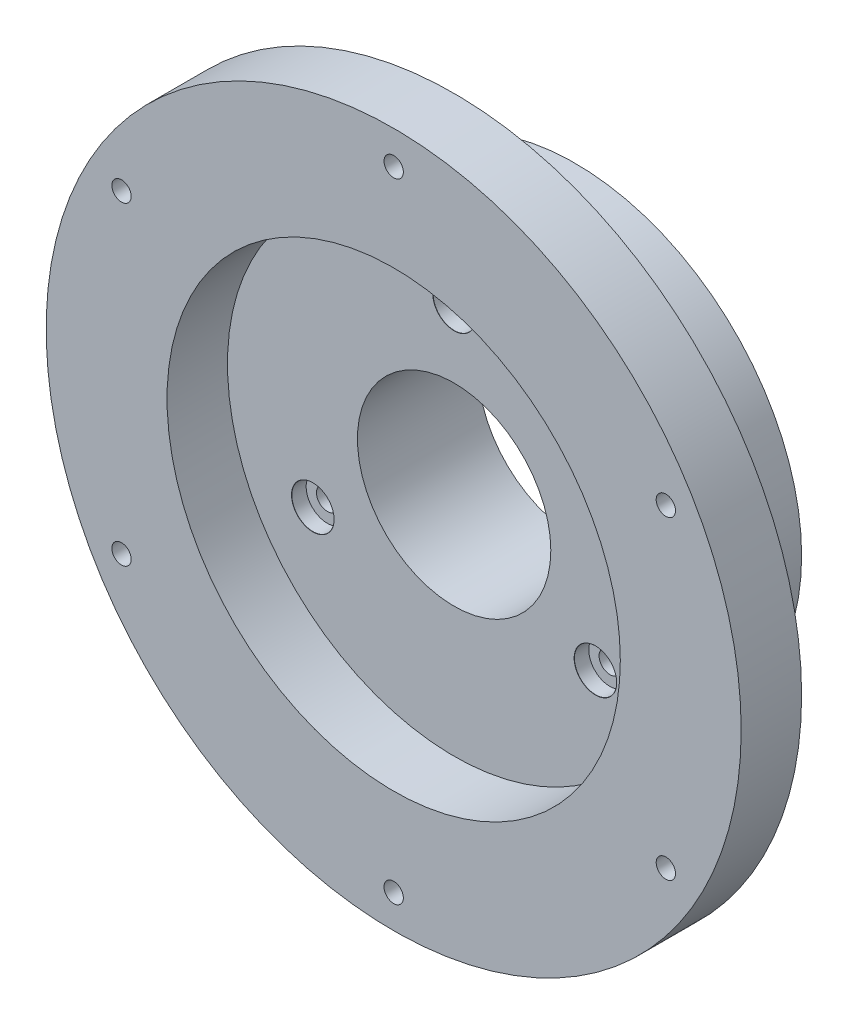
ISO-10303-21;
HEADER;
FILE_DESCRIPTION(('STEP AP214'),'2;1');
FILE_NAME('part.step','',(''),(''),'','','');
FILE_SCHEMA(('AUTOMOTIVE_DESIGN { 1 0 10303 214 1 1 1 1 }'));
ENDSEC;
DATA;
#1=APPLICATION_CONTEXT('core data for automotive mechanical design processes');
#2=APPLICATION_PROTOCOL_DEFINITION('international standard','automotive_design',2000,#1);
#3=PRODUCT_CONTEXT('',#1,'mechanical');
#4=PRODUCT('Part','Part','',(#3));
#5=PRODUCT_RELATED_PRODUCT_CATEGORY('part','',(#4));
#6=PRODUCT_DEFINITION_FORMATION('','',#4);
#7=PRODUCT_DEFINITION_CONTEXT('part definition',#1,'design');
#8=PRODUCT_DEFINITION('design','',#6,#7);
#9=PRODUCT_DEFINITION_SHAPE('','',#8);
#10=(LENGTH_UNIT() NAMED_UNIT(*) SI_UNIT(.MILLI.,.METRE.));
#11=(NAMED_UNIT(*) PLANE_ANGLE_UNIT() SI_UNIT($,.RADIAN.));
#12=(NAMED_UNIT(*) SI_UNIT($,.STERADIAN.) SOLID_ANGLE_UNIT());
#13=UNCERTAINTY_MEASURE_WITH_UNIT(LENGTH_MEASURE(1.E-05),#10,'distance_accuracy_value','');
#14=(GEOMETRIC_REPRESENTATION_CONTEXT(3) GLOBAL_UNCERTAINTY_ASSIGNED_CONTEXT((#13)) GLOBAL_UNIT_ASSIGNED_CONTEXT((#10,
#11,#12)) REPRESENTATION_CONTEXT('',''));
#15=CARTESIAN_POINT('',(0.,0.,0.));
#16=DIRECTION('',(0.,0.,1.));
#17=DIRECTION('',(1.,0.,0.));
#18=AXIS2_PLACEMENT_3D('',#15,#16,#17);
#19=CARTESIAN_POINT('',(0.,0.,-142.634559672906));
#20=DIRECTION('',(0.,0.,1.));
#21=DIRECTION('',(1.,0.,0.));
#22=AXIS2_PLACEMENT_3D('',#19,#20,#21);
#23=CYLINDRICAL_SURFACE('',#22,57.5);
#24=CARTESIAN_POINT('',(0.,0.,20.));
#25=DIRECTION('',(0.,0.,1.));
#26=DIRECTION('',(1.,0.,0.));
#27=AXIS2_PLACEMENT_3D('',#24,#25,#26);
#28=CIRCLE('',#27,57.5);
#29=CARTESIAN_POINT('',(57.5,0.,20.));
#30=VERTEX_POINT('',#29);
#31=EDGE_CURVE('E11',#30,#30,#28,.F.);
#32=ORIENTED_EDGE('',*,*,#31,.F.);
#33=EDGE_LOOP('',(#32));
#34=FACE_BOUND('',#33,.T.);
#35=CARTESIAN_POINT('',(0.,0.,30.));
#36=DIRECTION('',(0.,0.,1.));
#37=DIRECTION('',(1.,0.,0.));
#38=AXIS2_PLACEMENT_3D('',#35,#36,#37);
#39=CIRCLE('',#38,57.5);
#40=CARTESIAN_POINT('',(57.5,0.,30.));
#41=VERTEX_POINT('',#40);
#42=EDGE_CURVE('E57',#41,#41,#39,.T.);
#43=ORIENTED_EDGE('',*,*,#42,.F.);
#44=EDGE_LOOP('',(#43));
#45=FACE_BOUND('',#44,.T.);
#46=ADVANCED_FACE('F45',(#34,#45),#23,.T.);
#47=CARTESIAN_POINT('',(0.,0.,30.));
#48=DIRECTION('',(0.,0.,1.));
#49=DIRECTION('',(1.,0.,0.));
#50=AXIS2_PLACEMENT_3D('',#47,#48,#49);
#51=PLANE('',#50);
#52=CARTESIAN_POINT('',(0.,52.,30.));
#53=DIRECTION('',(0.,0.,1.));
#54=DIRECTION('',(1.,0.,0.));
#55=AXIS2_PLACEMENT_3D('',#52,#53,#54);
#56=CIRCLE('',#55,1.6);
#57=CARTESIAN_POINT('',(1.6,52.,30.));
#58=VERTEX_POINT('',#57);
#59=EDGE_CURVE('E72',#58,#58,#56,.T.);
#60=ORIENTED_EDGE('',*,*,#59,.F.);
#61=EDGE_LOOP('',(#60));
#62=FACE_BOUND('',#61,.T.);
#63=CARTESIAN_POINT('',(-45.0333209967897,25.9999999999981,30.));
#64=DIRECTION('',(0.,0.,1.));
#65=DIRECTION('',(1.,0.,0.));
#66=AXIS2_PLACEMENT_3D('',#63,#64,#65);
#67=CIRCLE('',#66,1.60000000000223);
#68=CARTESIAN_POINT('',(-43.4333209967875,25.9999999999981,30.));
#69=VERTEX_POINT('',#68);
#70=EDGE_CURVE('E157',#69,#69,#67,.T.);
#71=ORIENTED_EDGE('',*,*,#70,.F.);
#72=EDGE_LOOP('',(#71));
#73=FACE_BOUND('',#72,.T.);
#74=CARTESIAN_POINT('',(-45.0333209967875,-26.0000000000019,30.));
#75=DIRECTION('',(0.,0.,1.));
#76=DIRECTION('',(1.,0.,0.));
#77=AXIS2_PLACEMENT_3D('',#74,#75,#76);
#78=CIRCLE('',#77,1.60000000000421);
#79=CARTESIAN_POINT('',(-43.4333209967833,-26.0000000000019,30.));
#80=VERTEX_POINT('',#79);
#81=EDGE_CURVE('E61',#80,#80,#78,.T.);
#82=ORIENTED_EDGE('',*,*,#81,.F.);
#83=EDGE_LOOP('',(#82));
#84=FACE_BOUND('',#83,.T.);
#85=CARTESIAN_POINT('',(4.41468218107633E-12,-52.,30.));
#86=DIRECTION('',(0.,0.,1.));
#87=DIRECTION('',(1.,0.,0.));
#88=AXIS2_PLACEMENT_3D('',#85,#86,#87);
#89=CIRCLE('',#88,1.60000000000457);
#90=CARTESIAN_POINT('',(1.60000000000898,-52.,30.));
#91=VERTEX_POINT('',#90);
#92=EDGE_CURVE('E154',#91,#91,#89,.T.);
#93=ORIENTED_EDGE('',*,*,#92,.F.);
#94=EDGE_LOOP('',(#93));
#95=FACE_BOUND('',#94,.T.);
#96=CARTESIAN_POINT('',(45.0333209967941,-25.9999999999981,30.));
#97=DIRECTION('',(0.,0.,1.));
#98=DIRECTION('',(1.,0.,0.));
#99=AXIS2_PLACEMENT_3D('',#96,#97,#98);
#100=CIRCLE('',#99,1.60000000000285);
#101=CARTESIAN_POINT('',(46.633320996797,-25.9999999999981,30.));
#102=VERTEX_POINT('',#101);
#103=EDGE_CURVE('E150',#102,#102,#100,.T.);
#104=ORIENTED_EDGE('',*,*,#103,.F.);
#105=EDGE_LOOP('',(#104));
#106=FACE_BOUND('',#105,.T.);
#107=CARTESIAN_POINT('',(45.0333209967919,26.0000000000019,30.));
#108=DIRECTION('',(0.,0.,1.));
#109=DIRECTION('',(1.,0.,0.));
#110=AXIS2_PLACEMENT_3D('',#107,#108,#109);
#111=CIRCLE('',#110,1.60000000000062);
#112=CARTESIAN_POINT('',(46.6333209967925,26.0000000000019,30.));
#113=VERTEX_POINT('',#112);
#114=EDGE_CURVE('E141',#113,#113,#111,.T.);
#115=ORIENTED_EDGE('',*,*,#114,.F.);
#116=EDGE_LOOP('',(#115));
#117=FACE_BOUND('',#116,.T.);
#118=CARTESIAN_POINT('',(0.,0.,30.));
#119=DIRECTION('',(0.,0.,1.));
#120=DIRECTION('',(1.,0.,0.));
#121=AXIS2_PLACEMENT_3D('',#118,#119,#120);
#122=CIRCLE('',#121,37.5);
#123=CARTESIAN_POINT('',(37.5,0.,30.));
#124=VERTEX_POINT('',#123);
#125=EDGE_CURVE('E63',#124,#124,#122,.T.);
#126=ORIENTED_EDGE('',*,*,#125,.F.);
#127=EDGE_LOOP('',(#126));
#128=FACE_BOUND('',#127,.T.);
#129=ORIENTED_EDGE('',*,*,#42,.T.);
#130=EDGE_LOOP('',(#129));
#131=FACE_BOUND('',#130,.T.);
#132=ADVANCED_FACE('F102',(#62,#73,#84,#95,#106,#117,#128,#131),#51,.T.);
#133=CARTESIAN_POINT('',(0.,0.,-142.634559672906));
#134=DIRECTION('',(0.,0.,1.));
#135=DIRECTION('',(1.,0.,0.));
#136=AXIS2_PLACEMENT_3D('',#133,#134,#135);
#137=CYLINDRICAL_SURFACE('',#136,37.5);
#138=CARTESIAN_POINT('',(0.,0.,20.));
#139=DIRECTION('',(0.,0.,1.));
#140=DIRECTION('',(1.,0.,0.));
#141=AXIS2_PLACEMENT_3D('',#138,#139,#140);
#142=CIRCLE('',#141,37.5);
#143=CARTESIAN_POINT('',(37.5,0.,20.));
#144=VERTEX_POINT('',#143);
#145=EDGE_CURVE('E52',#144,#144,#142,.F.);
#146=ORIENTED_EDGE('',*,*,#145,.T.);
#147=EDGE_LOOP('',(#146));
#148=FACE_BOUND('',#147,.T.);
#149=ORIENTED_EDGE('',*,*,#125,.T.);
#150=EDGE_LOOP('',(#149));
#151=FACE_BOUND('',#150,.T.);
#152=ADVANCED_FACE('F107',(#148,#151),#137,.F.);
#153=CARTESIAN_POINT('',(0.,0.,20.));
#154=DIRECTION('',(0.,0.,1.));
#155=DIRECTION('',(1.,0.,0.));
#156=AXIS2_PLACEMENT_3D('',#153,#154,#155);
#157=PLANE('',#156);
#158=CARTESIAN_POINT('',(0.,52.,20.));
#159=DIRECTION('',(0.,0.,1.));
#160=DIRECTION('',(1.,0.,0.));
#161=AXIS2_PLACEMENT_3D('',#158,#159,#160);
#162=CIRCLE('',#161,1.6);
#163=CARTESIAN_POINT('',(1.6,52.,20.));
#164=VERTEX_POINT('',#163);
#165=EDGE_CURVE('E48',#164,#164,#162,.T.);
#166=ORIENTED_EDGE('',*,*,#165,.T.);
#167=EDGE_LOOP('',(#166));
#168=FACE_BOUND('',#167,.T.);
#169=CARTESIAN_POINT('',(-45.0333209967897,25.9999999999981,20.));
#170=DIRECTION('',(0.,0.,1.));
#171=DIRECTION('',(1.,0.,0.));
#172=AXIS2_PLACEMENT_3D('',#169,#170,#171);
#173=CIRCLE('',#172,1.60000000000223);
#174=CARTESIAN_POINT('',(-43.4333209967875,25.9999999999981,20.));
#175=VERTEX_POINT('',#174);
#176=EDGE_CURVE('E80',#175,#175,#173,.T.);
#177=ORIENTED_EDGE('',*,*,#176,.T.);
#178=EDGE_LOOP('',(#177));
#179=FACE_BOUND('',#178,.T.);
#180=CARTESIAN_POINT('',(-45.0333209967875,-26.0000000000019,20.));
#181=DIRECTION('',(0.,0.,1.));
#182=DIRECTION('',(1.,0.,0.));
#183=AXIS2_PLACEMENT_3D('',#180,#181,#182);
#184=CIRCLE('',#183,1.60000000000421);
#185=CARTESIAN_POINT('',(-43.4333209967833,-26.0000000000019,20.));
#186=VERTEX_POINT('',#185);
#187=EDGE_CURVE('E78',#186,#186,#184,.T.);
#188=ORIENTED_EDGE('',*,*,#187,.T.);
#189=EDGE_LOOP('',(#188));
#190=FACE_BOUND('',#189,.T.);
#191=CARTESIAN_POINT('',(4.41468218107633E-12,-52.,20.));
#192=DIRECTION('',(0.,0.,1.));
#193=DIRECTION('',(1.,0.,0.));
#194=AXIS2_PLACEMENT_3D('',#191,#192,#193);
#195=CIRCLE('',#194,1.60000000000457);
#196=CARTESIAN_POINT('',(1.60000000000898,-52.,20.));
#197=VERTEX_POINT('',#196);
#198=EDGE_CURVE('E75',#197,#197,#195,.T.);
#199=ORIENTED_EDGE('',*,*,#198,.T.);
#200=EDGE_LOOP('',(#199));
#201=FACE_BOUND('',#200,.T.);
#202=CARTESIAN_POINT('',(45.0333209967941,-25.9999999999981,20.));
#203=DIRECTION('',(0.,0.,1.));
#204=DIRECTION('',(1.,0.,0.));
#205=AXIS2_PLACEMENT_3D('',#202,#203,#204);
#206=CIRCLE('',#205,1.60000000000285);
#207=CARTESIAN_POINT('',(46.633320996797,-25.9999999999981,20.));
#208=VERTEX_POINT('',#207);
#209=EDGE_CURVE('E71',#208,#208,#206,.T.);
#210=ORIENTED_EDGE('',*,*,#209,.T.);
#211=EDGE_LOOP('',(#210));
#212=FACE_BOUND('',#211,.T.);
#213=CARTESIAN_POINT('',(45.0333209967919,26.0000000000019,20.));
#214=DIRECTION('',(0.,0.,1.));
#215=DIRECTION('',(1.,0.,0.));
#216=AXIS2_PLACEMENT_3D('',#213,#214,#215);
#217=CIRCLE('',#216,1.60000000000062);
#218=CARTESIAN_POINT('',(46.6333209967925,26.0000000000019,20.));
#219=VERTEX_POINT('',#218);
#220=EDGE_CURVE('E68',#219,#219,#217,.T.);
#221=ORIENTED_EDGE('',*,*,#220,.T.);
#222=EDGE_LOOP('',(#221));
#223=FACE_BOUND('',#222,.T.);
#224=ORIENTED_EDGE('',*,*,#31,.T.);
#225=EDGE_LOOP('',(#224));
#226=FACE_BOUND('',#225,.T.);
#227=ORIENTED_EDGE('',*,*,#145,.F.);
#228=EDGE_LOOP('',(#227));
#229=FACE_BOUND('',#228,.T.);
#230=ADVANCED_FACE('F87',(#168,#179,#190,#201,#212,#223,#226,#229),#157,.F.);
#231=CARTESIAN_POINT('',(45.0333209967919,26.0000000000019,0.));
#232=DIRECTION('',(0.,0.,1.));
#233=DIRECTION('',(1.,0.,0.));
#234=AXIS2_PLACEMENT_3D('',#231,#232,#233);
#235=CYLINDRICAL_SURFACE('',#234,1.60000000000062);
#236=ORIENTED_EDGE('',*,*,#114,.T.);
#237=EDGE_LOOP('',(#236));
#238=FACE_BOUND('',#237,.T.);
#239=ORIENTED_EDGE('',*,*,#220,.F.);
#240=EDGE_LOOP('',(#239));
#241=FACE_BOUND('',#240,.T.);
#242=ADVANCED_FACE('F122',(#238,#241),#235,.F.);
#243=CARTESIAN_POINT('',(45.0333209967941,-25.9999999999981,0.));
#244=DIRECTION('',(0.,0.,1.));
#245=DIRECTION('',(1.,0.,0.));
#246=AXIS2_PLACEMENT_3D('',#243,#244,#245);
#247=CYLINDRICAL_SURFACE('',#246,1.60000000000285);
#248=ORIENTED_EDGE('',*,*,#103,.T.);
#249=EDGE_LOOP('',(#248));
#250=FACE_BOUND('',#249,.T.);
#251=ORIENTED_EDGE('',*,*,#209,.F.);
#252=EDGE_LOOP('',(#251));
#253=FACE_BOUND('',#252,.T.);
#254=ADVANCED_FACE('F129',(#250,#253),#247,.F.);
#255=CARTESIAN_POINT('',(4.41468218107633E-12,-52.,0.));
#256=DIRECTION('',(0.,0.,1.));
#257=DIRECTION('',(1.,0.,0.));
#258=AXIS2_PLACEMENT_3D('',#255,#256,#257);
#259=CYLINDRICAL_SURFACE('',#258,1.60000000000457);
#260=ORIENTED_EDGE('',*,*,#92,.T.);
#261=EDGE_LOOP('',(#260));
#262=FACE_BOUND('',#261,.T.);
#263=ORIENTED_EDGE('',*,*,#198,.F.);
#264=EDGE_LOOP('',(#263));
#265=FACE_BOUND('',#264,.T.);
#266=ADVANCED_FACE('F125',(#262,#265),#259,.F.);
#267=CARTESIAN_POINT('',(-45.0333209967875,-26.0000000000019,0.));
#268=DIRECTION('',(0.,0.,1.));
#269=DIRECTION('',(1.,0.,0.));
#270=AXIS2_PLACEMENT_3D('',#267,#268,#269);
#271=CYLINDRICAL_SURFACE('',#270,1.60000000000421);
#272=ORIENTED_EDGE('',*,*,#81,.T.);
#273=EDGE_LOOP('',(#272));
#274=FACE_BOUND('',#273,.T.);
#275=ORIENTED_EDGE('',*,*,#187,.F.);
#276=EDGE_LOOP('',(#275));
#277=FACE_BOUND('',#276,.T.);
#278=ADVANCED_FACE('F97',(#274,#277),#271,.F.);
#279=CARTESIAN_POINT('',(-45.0333209967897,25.9999999999981,0.));
#280=DIRECTION('',(0.,0.,1.));
#281=DIRECTION('',(1.,0.,0.));
#282=AXIS2_PLACEMENT_3D('',#279,#280,#281);
#283=CYLINDRICAL_SURFACE('',#282,1.60000000000223);
#284=ORIENTED_EDGE('',*,*,#70,.T.);
#285=EDGE_LOOP('',(#284));
#286=FACE_BOUND('',#285,.T.);
#287=ORIENTED_EDGE('',*,*,#176,.F.);
#288=EDGE_LOOP('',(#287));
#289=FACE_BOUND('',#288,.T.);
#290=ADVANCED_FACE('F91',(#286,#289),#283,.F.);
#291=CARTESIAN_POINT('',(0.,52.,0.));
#292=DIRECTION('',(0.,0.,1.));
#293=DIRECTION('',(1.,0.,0.));
#294=AXIS2_PLACEMENT_3D('',#291,#292,#293);
#295=CYLINDRICAL_SURFACE('',#294,1.6);
#296=ORIENTED_EDGE('',*,*,#59,.T.);
#297=EDGE_LOOP('',(#296));
#298=FACE_BOUND('',#297,.T.);
#299=ORIENTED_EDGE('',*,*,#165,.F.);
#300=EDGE_LOOP('',(#299));
#301=FACE_BOUND('',#300,.T.);
#302=ADVANCED_FACE('F89',(#298,#301),#295,.F.);
#303=CLOSED_SHELL('',(#46,#132,#152,#230,#242,#254,#266,#278,#290,#302));
#304=MANIFOLD_SOLID_BREP('B2',#303);
#305=CARTESIAN_POINT('',(0.,0.,20.));
#306=DIRECTION('',(0.,0.,1.));
#307=DIRECTION('',(1.,0.,0.));
#308=AXIS2_PLACEMENT_3D('',#305,#306,#307);
#309=PLANE('',#308);
#310=CARTESIAN_POINT('',(0.,27.,20.));
#311=DIRECTION('',(0.,0.,1.));
#312=DIRECTION('',(1.,0.,0.));
#313=AXIS2_PLACEMENT_3D('',#310,#311,#312);
#314=CIRCLE('',#313,3.525);
#315=CARTESIAN_POINT('',(3.525,27.,20.));
#316=VERTEX_POINT('',#315);
#317=EDGE_CURVE('E311',#316,#316,#314,.T.);
#318=ORIENTED_EDGE('',*,*,#317,.F.);
#319=EDGE_LOOP('',(#318));
#320=FACE_BOUND('',#319,.T.);
#321=CARTESIAN_POINT('',(-23.3826859021799,-13.4999999999999,20.));
#322=DIRECTION('',(0.,0.,1.));
#323=DIRECTION('',(1.,0.,0.));
#324=AXIS2_PLACEMENT_3D('',#321,#322,#323);
#325=CIRCLE('',#324,3.525);
#326=CARTESIAN_POINT('',(-19.8576859021799,-13.4999999999999,20.));
#327=VERTEX_POINT('',#326);
#328=EDGE_CURVE('E291',#327,#327,#325,.T.);
#329=ORIENTED_EDGE('',*,*,#328,.F.);
#330=EDGE_LOOP('',(#329));
#331=FACE_BOUND('',#330,.T.);
#332=CARTESIAN_POINT('',(23.3826859021799,-13.4999999999999,20.));
#333=DIRECTION('',(0.,0.,1.));
#334=DIRECTION('',(1.,0.,0.));
#335=AXIS2_PLACEMENT_3D('',#332,#333,#334);
#336=CIRCLE('',#335,3.525);
#337=CARTESIAN_POINT('',(26.9076859021799,-13.4999999999999,20.));
#338=VERTEX_POINT('',#337);
#339=EDGE_CURVE('E271',#338,#338,#336,.T.);
#340=ORIENTED_EDGE('',*,*,#339,.F.);
#341=EDGE_LOOP('',(#340));
#342=FACE_BOUND('',#341,.T.);
#343=CARTESIAN_POINT('',(0.,0.,20.));
#344=DIRECTION('',(0.,0.,1.));
#345=DIRECTION('',(1.,0.,0.));
#346=AXIS2_PLACEMENT_3D('',#343,#344,#345);
#347=CIRCLE('',#346,37.5);
#348=CARTESIAN_POINT('',(37.5,0.,20.));
#349=VERTEX_POINT('',#348);
#350=EDGE_CURVE('E44',#349,#349,#347,.T.);
#351=ORIENTED_EDGE('',*,*,#350,.T.);
#352=EDGE_LOOP('',(#351));
#353=FACE_BOUND('',#352,.T.);
#354=CARTESIAN_POINT('',(0.,0.,20.));
#355=DIRECTION('',(0.,0.,1.));
#356=DIRECTION('',(1.,0.,0.));
#357=AXIS2_PLACEMENT_3D('',#354,#355,#356);
#358=CIRCLE('',#357,16.);
#359=CARTESIAN_POINT('',(16.,0.,20.));
#360=VERTEX_POINT('',#359);
#361=EDGE_CURVE('E246',#360,#360,#358,.T.);
#362=ORIENTED_EDGE('',*,*,#361,.F.);
#363=EDGE_LOOP('',(#362));
#364=FACE_BOUND('',#363,.T.);
#365=ADVANCED_FACE('F233',(#320,#331,#342,#353,#364),#309,.T.);
#366=CARTESIAN_POINT('',(0.,0.,0.));
#367=DIRECTION('',(0.,0.,1.));
#368=DIRECTION('',(1.,0.,0.));
#369=AXIS2_PLACEMENT_3D('',#366,#367,#368);
#370=PLANE('',#369);
#371=CARTESIAN_POINT('',(0.,27.,0.));
#372=DIRECTION('',(0.,0.,1.));
#373=DIRECTION('',(1.,0.,0.));
#374=AXIS2_PLACEMENT_3D('',#371,#372,#373);
#375=CIRCLE('',#374,1.8);
#376=CARTESIAN_POINT('',(1.8,27.,0.));
#377=VERTEX_POINT('',#376);
#378=EDGE_CURVE('E295',#377,#377,#375,.T.);
#379=ORIENTED_EDGE('',*,*,#378,.T.);
#380=EDGE_LOOP('',(#379));
#381=FACE_BOUND('',#380,.T.);
#382=CARTESIAN_POINT('',(-23.3826859021799,-13.4999999999999,0.));
#383=DIRECTION('',(0.,0.,1.));
#384=DIRECTION('',(1.,0.,0.));
#385=AXIS2_PLACEMENT_3D('',#382,#383,#384);
#386=CIRCLE('',#385,1.8);
#387=CARTESIAN_POINT('',(-21.5826859021799,-13.4999999999999,0.));
#388=VERTEX_POINT('',#387);
#389=EDGE_CURVE('E275',#388,#388,#386,.T.);
#390=ORIENTED_EDGE('',*,*,#389,.T.);
#391=EDGE_LOOP('',(#390));
#392=FACE_BOUND('',#391,.T.);
#393=CARTESIAN_POINT('',(23.3826859021799,-13.4999999999999,0.));
#394=DIRECTION('',(0.,0.,1.));
#395=DIRECTION('',(1.,0.,0.));
#396=AXIS2_PLACEMENT_3D('',#393,#394,#395);
#397=CIRCLE('',#396,1.8);
#398=CARTESIAN_POINT('',(25.1826859021799,-13.4999999999999,0.));
#399=VERTEX_POINT('',#398);
#400=EDGE_CURVE('E252',#399,#399,#397,.T.);
#401=ORIENTED_EDGE('',*,*,#400,.T.);
#402=EDGE_LOOP('',(#401));
#403=FACE_BOUND('',#402,.T.);
#404=CARTESIAN_POINT('',(0.,0.,0.));
#405=DIRECTION('',(0.,0.,1.));
#406=DIRECTION('',(1.,0.,0.));
#407=AXIS2_PLACEMENT_3D('',#404,#405,#406);
#408=CIRCLE('',#407,37.5);
#409=CARTESIAN_POINT('',(37.5,0.,0.));
#410=VERTEX_POINT('',#409);
#411=EDGE_CURVE('E237',#410,#410,#408,.T.);
#412=ORIENTED_EDGE('',*,*,#411,.F.);
#413=EDGE_LOOP('',(#412));
#414=FACE_BOUND('',#413,.T.);
#415=CARTESIAN_POINT('',(0.,0.,0.));
#416=DIRECTION('',(0.,0.,1.));
#417=DIRECTION('',(1.,0.,0.));
#418=AXIS2_PLACEMENT_3D('',#415,#416,#417);
#419=CIRCLE('',#418,16.);
#420=CARTESIAN_POINT('',(16.,0.,0.));
#421=VERTEX_POINT('',#420);
#422=EDGE_CURVE('E248',#421,#421,#419,.T.);
#423=ORIENTED_EDGE('',*,*,#422,.T.);
#424=EDGE_LOOP('',(#423));
#425=FACE_BOUND('',#424,.T.);
#426=ADVANCED_FACE('F320',(#381,#392,#403,#414,#425),#370,.F.);
#427=CARTESIAN_POINT('',(0.,0.,20.));
#428=DIRECTION('',(0.,0.,-1.));
#429=DIRECTION('',(-1.,0.,0.));
#430=AXIS2_PLACEMENT_3D('',#427,#428,#429);
#431=CYLINDRICAL_SURFACE('',#430,37.5);
#432=ORIENTED_EDGE('',*,*,#350,.F.);
#433=EDGE_LOOP('',(#432));
#434=FACE_BOUND('',#433,.T.);
#435=ORIENTED_EDGE('',*,*,#411,.T.);
#436=EDGE_LOOP('',(#435));
#437=FACE_BOUND('',#436,.T.);
#438=ADVANCED_FACE('F235',(#434,#437),#431,.T.);
#439=CARTESIAN_POINT('',(0.,0.,20.));
#440=DIRECTION('',(0.,0.,-1.));
#441=DIRECTION('',(-1.,0.,0.));
#442=AXIS2_PLACEMENT_3D('',#439,#440,#441);
#443=CYLINDRICAL_SURFACE('',#442,16.);
#444=ORIENTED_EDGE('',*,*,#361,.T.);
#445=EDGE_LOOP('',(#444));
#446=FACE_BOUND('',#445,.T.);
#447=ORIENTED_EDGE('',*,*,#422,.F.);
#448=EDGE_LOOP('',(#447));
#449=FACE_BOUND('',#448,.T.);
#450=ADVANCED_FACE('F328',(#446,#449),#443,.F.);
#451=CARTESIAN_POINT('',(23.3826859021799,-13.4999999999999,20.));
#452=DIRECTION('',(0.,0.,1.));
#453=DIRECTION('',(1.,0.,0.));
#454=AXIS2_PLACEMENT_3D('',#451,#452,#453);
#455=CYLINDRICAL_SURFACE('',#454,1.8);
#456=ORIENTED_EDGE('',*,*,#400,.F.);
#457=EDGE_LOOP('',(#456));
#458=FACE_BOUND('',#457,.T.);
#459=CARTESIAN_POINT('',(23.3826859021799,-13.4999999999999,17.6));
#460=DIRECTION('',(0.,0.,1.));
#461=DIRECTION('',(1.,0.,0.));
#462=AXIS2_PLACEMENT_3D('',#459,#460,#461);
#463=CIRCLE('',#462,1.80000000000001);
#464=CARTESIAN_POINT('',(25.1826859021799,-13.4999999999999,17.6));
#465=VERTEX_POINT('',#464);
#466=EDGE_CURVE('E259',#465,#465,#463,.T.);
#467=ORIENTED_EDGE('',*,*,#466,.T.);
#468=EDGE_LOOP('',(#467));
#469=FACE_BOUND('',#468,.T.);
#470=ADVANCED_FACE('F331',(#458,#469),#455,.F.);
#471=CARTESIAN_POINT('',(26.8826859021799,-13.4999999999999,17.6));
#472=DIRECTION('',(0.,0.,-1.));
#473=DIRECTION('',(-1.,0.,0.));
#474=AXIS2_PLACEMENT_3D('',#471,#472,#473);
#475=PLANE('',#474);
#476=ORIENTED_EDGE('',*,*,#466,.F.);
#477=EDGE_LOOP('',(#476));
#478=FACE_BOUND('',#477,.T.);
#479=CARTESIAN_POINT('',(23.3826859021799,-13.4999999999999,17.6));
#480=DIRECTION('',(0.,0.,1.));
#481=DIRECTION('',(1.,0.,0.));
#482=AXIS2_PLACEMENT_3D('',#479,#480,#481);
#483=CIRCLE('',#482,3.5);
#484=CARTESIAN_POINT('',(26.8826859021799,-13.4999999999999,17.6));
#485=VERTEX_POINT('',#484);
#486=EDGE_CURVE('E263',#485,#485,#483,.T.);
#487=ORIENTED_EDGE('',*,*,#486,.T.);
#488=EDGE_LOOP('',(#487));
#489=FACE_BOUND('',#488,.T.);
#490=ADVANCED_FACE('F345',(#478,#489),#475,.F.);
#491=CARTESIAN_POINT('',(23.3826859021799,-13.4999999999999,20.));
#492=DIRECTION('',(0.,0.,1.));
#493=DIRECTION('',(1.,0.,0.));
#494=AXIS2_PLACEMENT_3D('',#491,#492,#493);
#495=CYLINDRICAL_SURFACE('',#494,3.5);
#496=ORIENTED_EDGE('',*,*,#486,.F.);
#497=EDGE_LOOP('',(#496));
#498=FACE_BOUND('',#497,.T.);
#499=CARTESIAN_POINT('',(23.3826859021799,-13.4999999999999,19.975));
#500=DIRECTION('',(0.,0.,1.));
#501=DIRECTION('',(1.,0.,0.));
#502=AXIS2_PLACEMENT_3D('',#499,#500,#501);
#503=CIRCLE('',#502,3.5);
#504=CARTESIAN_POINT('',(26.8826859021799,-13.4999999999999,19.975));
#505=VERTEX_POINT('',#504);
#506=EDGE_CURVE('E267',#505,#505,#503,.T.);
#507=ORIENTED_EDGE('',*,*,#506,.T.);
#508=EDGE_LOOP('',(#507));
#509=FACE_BOUND('',#508,.T.);
#510=ADVANCED_FACE('F349',(#498,#509),#495,.F.);
#511=CARTESIAN_POINT('',(23.3826859021799,-13.4999999999999,20.));
#512=DIRECTION('',(0.,0.,1.));
#513=DIRECTION('',(1.,0.,0.));
#514=AXIS2_PLACEMENT_3D('',#511,#512,#513);
#515=CONICAL_SURFACE('',#514,3.525,0.785398163397448);
#516=ORIENTED_EDGE('',*,*,#506,.F.);
#517=EDGE_LOOP('',(#516));
#518=FACE_BOUND('',#517,.T.);
#519=ORIENTED_EDGE('',*,*,#339,.T.);
#520=EDGE_LOOP('',(#519));
#521=FACE_BOUND('',#520,.T.);
#522=ADVANCED_FACE('F353',(#518,#521),#515,.F.);
#523=CARTESIAN_POINT('',(-23.3826859021799,-13.4999999999999,20.));
#524=DIRECTION('',(0.,0.,1.));
#525=DIRECTION('',(1.,0.,0.));
#526=AXIS2_PLACEMENT_3D('',#523,#524,#525);
#527=CYLINDRICAL_SURFACE('',#526,1.8);
#528=ORIENTED_EDGE('',*,*,#389,.F.);
#529=EDGE_LOOP('',(#528));
#530=FACE_BOUND('',#529,.T.);
#531=CARTESIAN_POINT('',(-23.3826859021799,-13.4999999999999,17.6));
#532=DIRECTION('',(0.,0.,1.));
#533=DIRECTION('',(1.,0.,0.));
#534=AXIS2_PLACEMENT_3D('',#531,#532,#533);
#535=CIRCLE('',#534,1.80000000000001);
#536=CARTESIAN_POINT('',(-21.5826859021799,-13.4999999999999,17.6));
#537=VERTEX_POINT('',#536);
#538=EDGE_CURVE('E279',#537,#537,#535,.T.);
#539=ORIENTED_EDGE('',*,*,#538,.T.);
#540=EDGE_LOOP('',(#539));
#541=FACE_BOUND('',#540,.T.);
#542=ADVANCED_FACE('F357',(#530,#541),#527,.F.);
#543=CARTESIAN_POINT('',(-19.8826859021799,-13.4999999999999,17.6));
#544=DIRECTION('',(0.,0.,-1.));
#545=DIRECTION('',(-1.,0.,0.));
#546=AXIS2_PLACEMENT_3D('',#543,#544,#545);
#547=PLANE('',#546);
#548=ORIENTED_EDGE('',*,*,#538,.F.);
#549=EDGE_LOOP('',(#548));
#550=FACE_BOUND('',#549,.T.);
#551=CARTESIAN_POINT('',(-23.3826859021799,-13.4999999999999,17.6));
#552=DIRECTION('',(0.,0.,1.));
#553=DIRECTION('',(1.,0.,0.));
#554=AXIS2_PLACEMENT_3D('',#551,#552,#553);
#555=CIRCLE('',#554,3.5);
#556=CARTESIAN_POINT('',(-19.8826859021799,-13.4999999999999,17.6));
#557=VERTEX_POINT('',#556);
#558=EDGE_CURVE('E283',#557,#557,#555,.T.);
#559=ORIENTED_EDGE('',*,*,#558,.T.);
#560=EDGE_LOOP('',(#559));
#561=FACE_BOUND('',#560,.T.);
#562=ADVANCED_FACE('F361',(#550,#561),#547,.F.);
#563=CARTESIAN_POINT('',(-23.3826859021799,-13.4999999999999,20.));
#564=DIRECTION('',(0.,0.,1.));
#565=DIRECTION('',(1.,0.,0.));
#566=AXIS2_PLACEMENT_3D('',#563,#564,#565);
#567=CYLINDRICAL_SURFACE('',#566,3.5);
#568=ORIENTED_EDGE('',*,*,#558,.F.);
#569=EDGE_LOOP('',(#568));
#570=FACE_BOUND('',#569,.T.);
#571=CARTESIAN_POINT('',(-23.3826859021799,-13.4999999999999,19.975));
#572=DIRECTION('',(0.,0.,1.));
#573=DIRECTION('',(1.,0.,0.));
#574=AXIS2_PLACEMENT_3D('',#571,#572,#573);
#575=CIRCLE('',#574,3.5);
#576=CARTESIAN_POINT('',(-19.8826859021799,-13.4999999999999,19.975));
#577=VERTEX_POINT('',#576);
#578=EDGE_CURVE('E287',#577,#577,#575,.T.);
#579=ORIENTED_EDGE('',*,*,#578,.T.);
#580=EDGE_LOOP('',(#579));
#581=FACE_BOUND('',#580,.T.);
#582=ADVANCED_FACE('F365',(#570,#581),#567,.F.);
#583=CARTESIAN_POINT('',(-23.3826859021799,-13.4999999999999,20.));
#584=DIRECTION('',(0.,0.,1.));
#585=DIRECTION('',(1.,0.,0.));
#586=AXIS2_PLACEMENT_3D('',#583,#584,#585);
#587=CONICAL_SURFACE('',#586,3.525,0.785398163397448);
#588=ORIENTED_EDGE('',*,*,#578,.F.);
#589=EDGE_LOOP('',(#588));
#590=FACE_BOUND('',#589,.T.);
#591=ORIENTED_EDGE('',*,*,#328,.T.);
#592=EDGE_LOOP('',(#591));
#593=FACE_BOUND('',#592,.T.);
#594=ADVANCED_FACE('F369',(#590,#593),#587,.F.);
#595=CARTESIAN_POINT('',(0.,27.,20.));
#596=DIRECTION('',(0.,0.,1.));
#597=DIRECTION('',(1.,0.,0.));
#598=AXIS2_PLACEMENT_3D('',#595,#596,#597);
#599=CYLINDRICAL_SURFACE('',#598,1.8);
#600=ORIENTED_EDGE('',*,*,#378,.F.);
#601=EDGE_LOOP('',(#600));
#602=FACE_BOUND('',#601,.T.);
#603=CARTESIAN_POINT('',(0.,27.,17.6));
#604=DIRECTION('',(0.,0.,1.));
#605=DIRECTION('',(1.,0.,0.));
#606=AXIS2_PLACEMENT_3D('',#603,#604,#605);
#607=CIRCLE('',#606,1.80000000000001);
#608=CARTESIAN_POINT('',(1.80000000000001,27.,17.6));
#609=VERTEX_POINT('',#608);
#610=EDGE_CURVE('E299',#609,#609,#607,.T.);
#611=ORIENTED_EDGE('',*,*,#610,.T.);
#612=EDGE_LOOP('',(#611));
#613=FACE_BOUND('',#612,.T.);
#614=ADVANCED_FACE('F373',(#602,#613),#599,.F.);
#615=CARTESIAN_POINT('',(3.5,27.,17.6));
#616=DIRECTION('',(0.,0.,-1.));
#617=DIRECTION('',(-1.,0.,0.));
#618=AXIS2_PLACEMENT_3D('',#615,#616,#617);
#619=PLANE('',#618);
#620=ORIENTED_EDGE('',*,*,#610,.F.);
#621=EDGE_LOOP('',(#620));
#622=FACE_BOUND('',#621,.T.);
#623=CARTESIAN_POINT('',(0.,27.,17.6));
#624=DIRECTION('',(0.,0.,1.));
#625=DIRECTION('',(1.,0.,0.));
#626=AXIS2_PLACEMENT_3D('',#623,#624,#625);
#627=CIRCLE('',#626,3.5);
#628=CARTESIAN_POINT('',(3.5,27.,17.6));
#629=VERTEX_POINT('',#628);
#630=EDGE_CURVE('E303',#629,#629,#627,.T.);
#631=ORIENTED_EDGE('',*,*,#630,.T.);
#632=EDGE_LOOP('',(#631));
#633=FACE_BOUND('',#632,.T.);
#634=ADVANCED_FACE('F377',(#622,#633),#619,.F.);
#635=CARTESIAN_POINT('',(0.,27.,20.));
#636=DIRECTION('',(0.,0.,1.));
#637=DIRECTION('',(1.,0.,0.));
#638=AXIS2_PLACEMENT_3D('',#635,#636,#637);
#639=CYLINDRICAL_SURFACE('',#638,3.5);
#640=ORIENTED_EDGE('',*,*,#630,.F.);
#641=EDGE_LOOP('',(#640));
#642=FACE_BOUND('',#641,.T.);
#643=CARTESIAN_POINT('',(0.,27.,19.975));
#644=DIRECTION('',(0.,0.,1.));
#645=DIRECTION('',(1.,0.,0.));
#646=AXIS2_PLACEMENT_3D('',#643,#644,#645);
#647=CIRCLE('',#646,3.5);
#648=CARTESIAN_POINT('',(3.5,27.,19.975));
#649=VERTEX_POINT('',#648);
#650=EDGE_CURVE('E307',#649,#649,#647,.T.);
#651=ORIENTED_EDGE('',*,*,#650,.T.);
#652=EDGE_LOOP('',(#651));
#653=FACE_BOUND('',#652,.T.);
#654=ADVANCED_FACE('F381',(#642,#653),#639,.F.);
#655=CARTESIAN_POINT('',(0.,27.,20.));
#656=DIRECTION('',(0.,0.,1.));
#657=DIRECTION('',(1.,0.,0.));
#658=AXIS2_PLACEMENT_3D('',#655,#656,#657);
#659=CONICAL_SURFACE('',#658,3.525,0.785398163397448);
#660=ORIENTED_EDGE('',*,*,#650,.F.);
#661=EDGE_LOOP('',(#660));
#662=FACE_BOUND('',#661,.T.);
#663=ORIENTED_EDGE('',*,*,#317,.T.);
#664=EDGE_LOOP('',(#663));
#665=FACE_BOUND('',#664,.T.);
#666=ADVANCED_FACE('F316',(#662,#665),#659,.F.);
#667=CLOSED_SHELL('',(#365,#426,#438,#450,#470,#490,#510,#522,#542,#562,#582,#594,#614,#634,
#654,#666));
#668=MANIFOLD_SOLID_BREP('B6',#667);
#669=ADVANCED_BREP_SHAPE_REPRESENTATION('',(#18,#304,#668),#14);
#670=SHAPE_DEFINITION_REPRESENTATION(#9,#669);
ENDSEC;
END-ISO-10303-21;
